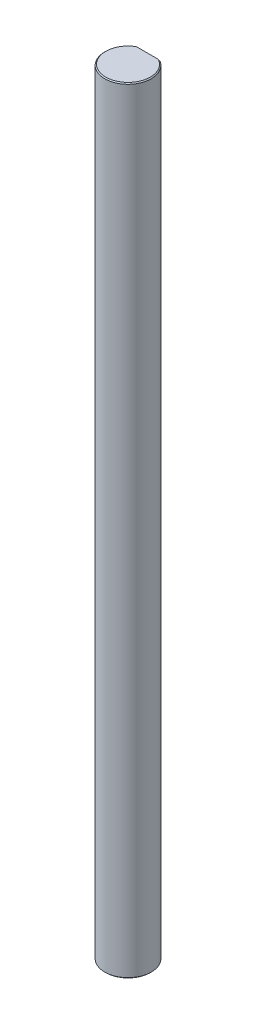
ISO-10303-21;
HEADER;
FILE_DESCRIPTION(('STEP AP214'),'2;1');
FILE_NAME('part.step','',(''),(''),'','','');
FILE_SCHEMA(('AUTOMOTIVE_DESIGN { 1 0 10303 214 1 1 1 1 }'));
ENDSEC;
DATA;
#1=APPLICATION_CONTEXT('core data for automotive mechanical design processes');
#2=APPLICATION_PROTOCOL_DEFINITION('international standard','automotive_design',2000,#1);
#3=PRODUCT_CONTEXT('',#1,'mechanical');
#4=PRODUCT('Part','Part','',(#3));
#5=PRODUCT_RELATED_PRODUCT_CATEGORY('part','',(#4));
#6=PRODUCT_DEFINITION_FORMATION('','',#4);
#7=PRODUCT_DEFINITION_CONTEXT('part definition',#1,'design');
#8=PRODUCT_DEFINITION('design','',#6,#7);
#9=PRODUCT_DEFINITION_SHAPE('','',#8);
#10=(LENGTH_UNIT() NAMED_UNIT(*) SI_UNIT(.MILLI.,.METRE.));
#11=(NAMED_UNIT(*) PLANE_ANGLE_UNIT() SI_UNIT($,.RADIAN.));
#12=(NAMED_UNIT(*) SI_UNIT($,.STERADIAN.) SOLID_ANGLE_UNIT());
#13=UNCERTAINTY_MEASURE_WITH_UNIT(LENGTH_MEASURE(1.E-05),#10,'distance_accuracy_value','');
#14=(GEOMETRIC_REPRESENTATION_CONTEXT(3) GLOBAL_UNCERTAINTY_ASSIGNED_CONTEXT((#13)) GLOBAL_UNIT_ASSIGNED_CONTEXT((#10,
#11,#12)) REPRESENTATION_CONTEXT('',''));
#15=CARTESIAN_POINT('',(0.,0.,0.));
#16=DIRECTION('',(0.,0.,1.));
#17=DIRECTION('',(1.,0.,0.));
#18=AXIS2_PLACEMENT_3D('',#15,#16,#17);
#19=CARTESIAN_POINT('',(0.,0.,0.));
#20=DIRECTION('',(0.,1.,0.));
#21=DIRECTION('',(0.,0.,1.));
#22=AXIS2_PLACEMENT_3D('',#19,#20,#21);
#23=PLANE('',#22);
#24=CARTESIAN_POINT('',(0.,0.,0.));
#25=DIRECTION('',(0.,1.,0.));
#26=DIRECTION('',(0.,0.,1.));
#27=AXIS2_PLACEMENT_3D('',#24,#25,#26);
#28=CIRCLE('',#27,2.87499999996044);
#29=CARTESIAN_POINT('',(-1.41972708640998,0.,-2.5));
#30=VERTEX_POINT('',#29);
#31=CARTESIAN_POINT('',(1.41972708640998,0.,-2.5));
#32=VERTEX_POINT('',#31);
#33=EDGE_CURVE('E19',#30,#32,#28,.T.);
#34=ORIENTED_EDGE('',*,*,#33,.F.);
#35=DIRECTION('',(-1.,0.,0.));
#36=VECTOR('',#35,1.);
#37=CARTESIAN_POINT('',(0.,0.,-2.5));
#38=LINE('',#37,#36);
#39=EDGE_CURVE('E57',#32,#30,#38,.T.);
#40=ORIENTED_EDGE('',*,*,#39,.F.);
#41=EDGE_LOOP('',(#34,#40));
#42=FACE_BOUND('',#41,.T.);
#43=ADVANCED_FACE('F16',(#42),#23,.F.);
#44=CARTESIAN_POINT('',(0.,100.,0.));
#45=DIRECTION('',(0.,1.,0.));
#46=DIRECTION('',(0.,0.,1.));
#47=AXIS2_PLACEMENT_3D('',#44,#45,#46);
#48=PLANE('',#47);
#49=CARTESIAN_POINT('',(0.,99.9999999999659,0.));
#50=DIRECTION('',(0.,-1.,0.));
#51=DIRECTION('',(0.,0.,-1.));
#52=AXIS2_PLACEMENT_3D('',#49,#50,#51);
#53=CIRCLE('',#52,2.87499999996044);
#54=CARTESIAN_POINT('',(1.41972708640998,99.9999999999829,-2.5));
#55=VERTEX_POINT('',#54);
#56=CARTESIAN_POINT('',(-1.41972708640998,99.9999999999829,-2.5));
#57=VERTEX_POINT('',#56);
#58=EDGE_CURVE('E59',#55,#57,#53,.T.);
#59=ORIENTED_EDGE('',*,*,#58,.F.);
#60=DIRECTION('',(-1.,0.,0.));
#61=VECTOR('',#60,1.);
#62=CARTESIAN_POINT('',(0.,100.,-2.5));
#63=LINE('',#62,#61);
#64=EDGE_CURVE('E74',#57,#55,#63,.F.);
#65=ORIENTED_EDGE('',*,*,#64,.F.);
#66=EDGE_LOOP('',(#59,#65));
#67=FACE_BOUND('',#66,.T.);
#68=ADVANCED_FACE('F92',(#67),#48,.T.);
#69=CARTESIAN_POINT('',(0.,0.124999999911779,0.));
#70=DIRECTION('',(0.,1.,0.));
#71=DIRECTION('',(0.,0.,1.));
#72=AXIS2_PLACEMENT_3D('',#69,#70,#71);
#73=CONICAL_SURFACE('',#72,2.99999999987222,0.785398163397448);
#74=CARTESIAN_POINT('',(1.658312395178,0.125,-2.5));
#75=CARTESIAN_POINT('',(1.5364815992333,0.0576554936562862,-2.5));
#76=CARTESIAN_POINT('',(1.41972708645,0.,-2.5));
#77=B_SPLINE_CURVE_WITH_KNOTS('',2,(#74,#75,#76),.UNSPECIFIED.,.F.,.F.,(3,3),(0.,1.),.UNSPECIFIED.);
#78=CARTESIAN_POINT('',(1.65831239517795,0.125,-2.49999999999993));
#79=VERTEX_POINT('',#78);
#80=EDGE_CURVE('E70',#79,#32,#77,.T.);
#81=ORIENTED_EDGE('',*,*,#80,.F.);
#82=CARTESIAN_POINT('',(0.,0.125,0.));
#83=DIRECTION('',(0.,-1.,0.));
#84=DIRECTION('',(0.,0.,-1.));
#85=AXIS2_PLACEMENT_3D('',#82,#83,#84);
#86=CIRCLE('',#85,3.);
#87=CARTESIAN_POINT('',(-1.65831239517785,0.125,-2.5));
#88=VERTEX_POINT('',#87);
#89=EDGE_CURVE('E63',#88,#79,#86,.F.);
#90=ORIENTED_EDGE('',*,*,#89,.F.);
#91=CARTESIAN_POINT('',(-1.41972708645,0.,-2.5));
#92=CARTESIAN_POINT('',(-1.53648159921875,0.0576554936500273,-2.5));
#93=CARTESIAN_POINT('',(-1.658312395178,0.125,-2.5));
#94=B_SPLINE_CURVE_WITH_KNOTS('',2,(#91,#92,#93),.UNSPECIFIED.,.F.,.F.,(3,3),(0.,1.),.UNSPECIFIED.);
#95=EDGE_CURVE('E61',#30,#88,#94,.T.);
#96=ORIENTED_EDGE('',*,*,#95,.F.);
#97=ORIENTED_EDGE('',*,*,#33,.T.);
#98=EDGE_LOOP('',(#81,#90,#96,#97));
#99=FACE_BOUND('',#98,.T.);
#100=ADVANCED_FACE('F62',(#99),#73,.T.);
#101=CARTESIAN_POINT('',(0.,99.8750000000541,0.));
#102=DIRECTION('',(0.,-1.,0.));
#103=DIRECTION('',(0.,0.,-1.));
#104=AXIS2_PLACEMENT_3D('',#101,#102,#103);
#105=CONICAL_SURFACE('',#104,2.99999999992906,0.785398163624822);
#106=ORIENTED_EDGE('',*,*,#58,.T.);
#107=CARTESIAN_POINT('',(-1.658312395178,99.875,-2.5));
#108=CARTESIAN_POINT('',(-1.53648159932246,99.9423445062923,-2.5));
#109=CARTESIAN_POINT('',(-1.41972708645,100.,-2.5));
#110=B_SPLINE_CURVE_WITH_KNOTS('',2,(#107,#108,#109),.UNSPECIFIED.,.F.,.F.,(3,3),(0.,1.),.UNSPECIFIED.);
#111=CARTESIAN_POINT('',(-1.65831239517795,99.875,-2.49999999999993));
#112=VERTEX_POINT('',#111);
#113=EDGE_CURVE('E66',#112,#57,#110,.T.);
#114=ORIENTED_EDGE('',*,*,#113,.F.);
#115=CARTESIAN_POINT('',(0.,99.875,0.));
#116=DIRECTION('',(0.,-1.,0.));
#117=DIRECTION('',(0.,0.,-1.));
#118=AXIS2_PLACEMENT_3D('',#115,#116,#117);
#119=CIRCLE('',#118,3.);
#120=CARTESIAN_POINT('',(1.65831239517795,99.875,-2.49999999999993));
#121=VERTEX_POINT('',#120);
#122=EDGE_CURVE('E25',#121,#112,#119,.T.);
#123=ORIENTED_EDGE('',*,*,#122,.F.);
#124=CARTESIAN_POINT('',(1.41972708645,100.,-2.5));
#125=CARTESIAN_POINT('',(1.53648159931886,99.9423445063098,-2.5));
#126=CARTESIAN_POINT('',(1.658312395178,99.875,-2.5));
#127=B_SPLINE_CURVE_WITH_KNOTS('',2,(#124,#125,#126),.UNSPECIFIED.,.F.,.F.,(3,3),(0.,1.),.UNSPECIFIED.);
#128=EDGE_CURVE('E79',#55,#121,#127,.T.);
#129=ORIENTED_EDGE('',*,*,#128,.F.);
#130=EDGE_LOOP('',(#106,#114,#123,#129));
#131=FACE_BOUND('',#130,.T.);
#132=ADVANCED_FACE('F88',(#131),#105,.T.);
#133=CARTESIAN_POINT('',(0.,100.,-2.5));
#134=DIRECTION('',(0.,0.,-1.));
#135=DIRECTION('',(-1.,0.,0.));
#136=AXIS2_PLACEMENT_3D('',#133,#134,#135);
#137=PLANE('',#136);
#138=ORIENTED_EDGE('',*,*,#128,.T.);
#139=DIRECTION('',(0.,-1.,0.));
#140=VECTOR('',#139,1.);
#141=CARTESIAN_POINT('',(1.65831239517791,100.,-2.49999999999986));
#142=LINE('',#141,#140);
#143=EDGE_CURVE('E78',#79,#121,#142,.F.);
#144=ORIENTED_EDGE('',*,*,#143,.F.);
#145=ORIENTED_EDGE('',*,*,#80,.T.);
#146=ORIENTED_EDGE('',*,*,#39,.T.);
#147=ORIENTED_EDGE('',*,*,#95,.T.);
#148=DIRECTION('',(0.,-1.,0.));
#149=VECTOR('',#148,1.);
#150=CARTESIAN_POINT('',(-1.65831239517791,100.,-2.49999999999986));
#151=LINE('',#150,#149);
#152=EDGE_CURVE('E11',#112,#88,#151,.T.);
#153=ORIENTED_EDGE('',*,*,#152,.F.);
#154=ORIENTED_EDGE('',*,*,#113,.T.);
#155=ORIENTED_EDGE('',*,*,#64,.T.);
#156=EDGE_LOOP('',(#138,#144,#145,#146,#147,#153,#154,#155));
#157=FACE_BOUND('',#156,.T.);
#158=ADVANCED_FACE('F68',(#157),#137,.T.);
#159=CARTESIAN_POINT('',(0.,100.,0.));
#160=DIRECTION('',(0.,-1.,0.));
#161=DIRECTION('',(0.,0.,-1.));
#162=AXIS2_PLACEMENT_3D('',#159,#160,#161);
#163=CYLINDRICAL_SURFACE('',#162,3.);
#164=ORIENTED_EDGE('',*,*,#122,.T.);
#165=ORIENTED_EDGE('',*,*,#152,.T.);
#166=ORIENTED_EDGE('',*,*,#89,.T.);
#167=ORIENTED_EDGE('',*,*,#143,.T.);
#168=EDGE_LOOP('',(#164,#165,#166,#167));
#169=FACE_BOUND('',#168,.T.);
#170=ADVANCED_FACE('F107',(#169),#163,.T.);
#171=CLOSED_SHELL('',(#43,#68,#100,#132,#158,#170));
#172=MANIFOLD_SOLID_BREP('B1',#171);
#173=ADVANCED_BREP_SHAPE_REPRESENTATION('',(#18,#172),#14);
#174=SHAPE_DEFINITION_REPRESENTATION(#9,#173);
ENDSEC;
END-ISO-10303-21;
